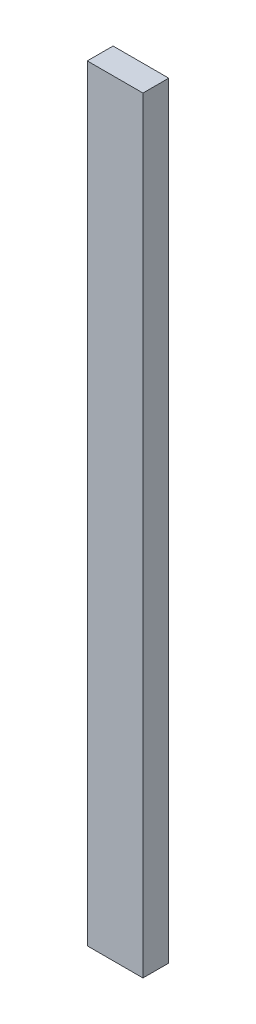
ISO-10303-21;
HEADER;
FILE_DESCRIPTION(('STEP AP214'),'2;1');
FILE_NAME('part.step','',(''),(''),'','','');
FILE_SCHEMA(('AUTOMOTIVE_DESIGN { 1 0 10303 214 1 1 1 1 }'));
ENDSEC;
DATA;
#1=APPLICATION_CONTEXT('core data for automotive mechanical design processes');
#2=APPLICATION_PROTOCOL_DEFINITION('international standard','automotive_design',2000,#1);
#3=PRODUCT_CONTEXT('',#1,'mechanical');
#4=PRODUCT('Part','Part','',(#3));
#5=PRODUCT_RELATED_PRODUCT_CATEGORY('part','',(#4));
#6=PRODUCT_DEFINITION_FORMATION('','',#4);
#7=PRODUCT_DEFINITION_CONTEXT('part definition',#1,'design');
#8=PRODUCT_DEFINITION('design','',#6,#7);
#9=PRODUCT_DEFINITION_SHAPE('','',#8);
#10=(LENGTH_UNIT() NAMED_UNIT(*) SI_UNIT(.MILLI.,.METRE.));
#11=(NAMED_UNIT(*) PLANE_ANGLE_UNIT() SI_UNIT($,.RADIAN.));
#12=(NAMED_UNIT(*) SI_UNIT($,.STERADIAN.) SOLID_ANGLE_UNIT());
#13=UNCERTAINTY_MEASURE_WITH_UNIT(LENGTH_MEASURE(1.E-05),#10,'distance_accuracy_value','');
#14=(GEOMETRIC_REPRESENTATION_CONTEXT(3) GLOBAL_UNCERTAINTY_ASSIGNED_CONTEXT((#13)) GLOBAL_UNIT_ASSIGNED_CONTEXT((#10,
#11,#12)) REPRESENTATION_CONTEXT('',''));
#15=CARTESIAN_POINT('',(0.,0.,0.));
#16=DIRECTION('',(0.,0.,1.));
#17=DIRECTION('',(1.,0.,0.));
#18=AXIS2_PLACEMENT_3D('',#15,#16,#17);
#19=CARTESIAN_POINT('',(-0.889,-14.859,1.));
#20=DIRECTION('',(1.,0.,0.));
#21=DIRECTION('',(0.,0.,-1.));
#22=AXIS2_PLACEMENT_3D('',#19,#20,#21);
#23=PLANE('',#22);
#24=DIRECTION('',(0.,-1.,0.));
#25=VECTOR('',#24,1.);
#26=CARTESIAN_POINT('',(-0.889,-14.859,0.));
#27=LINE('',#26,#25);
#28=CARTESIAN_POINT('',(-0.889,14.859,0.));
#29=VERTEX_POINT('',#28);
#30=CARTESIAN_POINT('',(-0.889,-14.859,0.));
#31=VERTEX_POINT('',#30);
#32=EDGE_CURVE('E95',#29,#31,#27,.T.);
#33=ORIENTED_EDGE('',*,*,#32,.T.);
#34=DIRECTION('',(0.,0.,-1.));
#35=VECTOR('',#34,1.);
#36=CARTESIAN_POINT('',(-0.889,-14.859,1.));
#37=LINE('',#36,#35);
#38=CARTESIAN_POINT('',(-0.889,-14.859,1.));
#39=VERTEX_POINT('',#38);
#40=EDGE_CURVE('E11',#39,#31,#37,.T.);
#41=ORIENTED_EDGE('',*,*,#40,.F.);
#42=DIRECTION('',(0.,-1.,0.));
#43=VECTOR('',#42,1.);
#44=CARTESIAN_POINT('',(-0.889,-14.859,1.));
#45=LINE('',#44,#43);
#46=CARTESIAN_POINT('',(-0.889,14.859,1.));
#47=VERTEX_POINT('',#46);
#48=EDGE_CURVE('E83',#47,#39,#45,.T.);
#49=ORIENTED_EDGE('',*,*,#48,.F.);
#50=DIRECTION('',(0.,0.,-1.));
#51=VECTOR('',#50,1.);
#52=CARTESIAN_POINT('',(-0.889,14.859,1.));
#53=LINE('',#52,#51);
#54=EDGE_CURVE('E91',#47,#29,#53,.T.);
#55=ORIENTED_EDGE('',*,*,#54,.T.);
#56=EDGE_LOOP('',(#33,#41,#49,#55));
#57=FACE_BOUND('',#56,.T.);
#58=ADVANCED_FACE('F32',(#57),#23,.F.);
#59=CARTESIAN_POINT('',(1.27,-14.859,1.));
#60=DIRECTION('',(0.,1.,0.));
#61=DIRECTION('',(0.,0.,1.));
#62=AXIS2_PLACEMENT_3D('',#59,#60,#61);
#63=PLANE('',#62);
#64=DIRECTION('',(1.,0.,0.));
#65=VECTOR('',#64,1.);
#66=CARTESIAN_POINT('',(1.27,-14.859,0.));
#67=LINE('',#66,#65);
#68=CARTESIAN_POINT('',(1.27,-14.859,0.));
#69=VERTEX_POINT('',#68);
#70=EDGE_CURVE('E87',#31,#69,#67,.T.);
#71=ORIENTED_EDGE('',*,*,#70,.T.);
#72=DIRECTION('',(0.,0.,-1.));
#73=VECTOR('',#72,1.);
#74=CARTESIAN_POINT('',(1.27,-14.859,1.));
#75=LINE('',#74,#73);
#76=CARTESIAN_POINT('',(1.27,-14.859,1.));
#77=VERTEX_POINT('',#76);
#78=EDGE_CURVE('E40',#77,#69,#75,.T.);
#79=ORIENTED_EDGE('',*,*,#78,.F.);
#80=DIRECTION('',(1.,0.,0.));
#81=VECTOR('',#80,1.);
#82=CARTESIAN_POINT('',(1.27,-14.859,1.));
#83=LINE('',#82,#81);
#84=EDGE_CURVE('E78',#39,#77,#83,.T.);
#85=ORIENTED_EDGE('',*,*,#84,.F.);
#86=ORIENTED_EDGE('',*,*,#40,.T.);
#87=EDGE_LOOP('',(#71,#79,#85,#86));
#88=FACE_BOUND('',#87,.T.);
#89=ADVANCED_FACE('F86',(#88),#63,.F.);
#90=CARTESIAN_POINT('',(1.27,14.859,1.));
#91=DIRECTION('',(-1.,0.,0.));
#92=DIRECTION('',(0.,0.,1.));
#93=AXIS2_PLACEMENT_3D('',#90,#91,#92);
#94=PLANE('',#93);
#95=DIRECTION('',(0.,1.,0.));
#96=VECTOR('',#95,1.);
#97=CARTESIAN_POINT('',(1.27,14.859,0.));
#98=LINE('',#97,#96);
#99=CARTESIAN_POINT('',(1.27,14.859,0.));
#100=VERTEX_POINT('',#99);
#101=EDGE_CURVE('E65',#69,#100,#98,.T.);
#102=ORIENTED_EDGE('',*,*,#101,.T.);
#103=DIRECTION('',(0.,0.,-1.));
#104=VECTOR('',#103,1.);
#105=CARTESIAN_POINT('',(1.27,14.859,1.));
#106=LINE('',#105,#104);
#107=CARTESIAN_POINT('',(1.27,14.859,1.));
#108=VERTEX_POINT('',#107);
#109=EDGE_CURVE('E88',#108,#100,#106,.T.);
#110=ORIENTED_EDGE('',*,*,#109,.F.);
#111=DIRECTION('',(0.,1.,0.));
#112=VECTOR('',#111,1.);
#113=CARTESIAN_POINT('',(1.27,14.859,1.));
#114=LINE('',#113,#112);
#115=EDGE_CURVE('E81',#77,#108,#114,.T.);
#116=ORIENTED_EDGE('',*,*,#115,.F.);
#117=ORIENTED_EDGE('',*,*,#78,.T.);
#118=EDGE_LOOP('',(#102,#110,#116,#117));
#119=FACE_BOUND('',#118,.T.);
#120=ADVANCED_FACE('F89',(#119),#94,.F.);
#121=CARTESIAN_POINT('',(-0.889,14.859,1.));
#122=DIRECTION('',(0.,-1.,0.));
#123=DIRECTION('',(0.,0.,-1.));
#124=AXIS2_PLACEMENT_3D('',#121,#122,#123);
#125=PLANE('',#124);
#126=DIRECTION('',(-1.,0.,0.));
#127=VECTOR('',#126,1.);
#128=CARTESIAN_POINT('',(-0.889,14.859,0.));
#129=LINE('',#128,#127);
#130=EDGE_CURVE('E71',#100,#29,#129,.T.);
#131=ORIENTED_EDGE('',*,*,#130,.T.);
#132=ORIENTED_EDGE('',*,*,#54,.F.);
#133=DIRECTION('',(-1.,0.,0.));
#134=VECTOR('',#133,1.);
#135=CARTESIAN_POINT('',(-0.889,14.859,1.));
#136=LINE('',#135,#134);
#137=EDGE_CURVE('E48',#108,#47,#136,.T.);
#138=ORIENTED_EDGE('',*,*,#137,.F.);
#139=ORIENTED_EDGE('',*,*,#109,.T.);
#140=EDGE_LOOP('',(#131,#132,#138,#139));
#141=FACE_BOUND('',#140,.T.);
#142=ADVANCED_FACE('F102',(#141),#125,.F.);
#143=CARTESIAN_POINT('',(0.,0.,1.));
#144=DIRECTION('',(0.,0.,-1.));
#145=DIRECTION('',(-1.,0.,0.));
#146=AXIS2_PLACEMENT_3D('',#143,#144,#145);
#147=PLANE('',#146);
#148=ORIENTED_EDGE('',*,*,#48,.T.);
#149=ORIENTED_EDGE('',*,*,#84,.T.);
#150=ORIENTED_EDGE('',*,*,#115,.T.);
#151=ORIENTED_EDGE('',*,*,#137,.T.);
#152=EDGE_LOOP('',(#148,#149,#150,#151));
#153=FACE_BOUND('',#152,.T.);
#154=ADVANCED_FACE('F79',(#153),#147,.F.);
#155=CARTESIAN_POINT('',(0.,0.,0.));
#156=DIRECTION('',(0.,0.,-1.));
#157=DIRECTION('',(-1.,0.,0.));
#158=AXIS2_PLACEMENT_3D('',#155,#156,#157);
#159=PLANE('',#158);
#160=ORIENTED_EDGE('',*,*,#32,.F.);
#161=ORIENTED_EDGE('',*,*,#130,.F.);
#162=ORIENTED_EDGE('',*,*,#101,.F.);
#163=ORIENTED_EDGE('',*,*,#70,.F.);
#164=EDGE_LOOP('',(#160,#161,#162,#163));
#165=FACE_BOUND('',#164,.T.);
#166=ADVANCED_FACE('F105',(#165),#159,.T.);
#167=CLOSED_SHELL('',(#58,#89,#120,#142,#154,#166));
#168=MANIFOLD_SOLID_BREP('B2',#167);
#169=ADVANCED_BREP_SHAPE_REPRESENTATION('',(#18,#168),#14);
#170=SHAPE_DEFINITION_REPRESENTATION(#9,#169);
ENDSEC;
END-ISO-10303-21;
